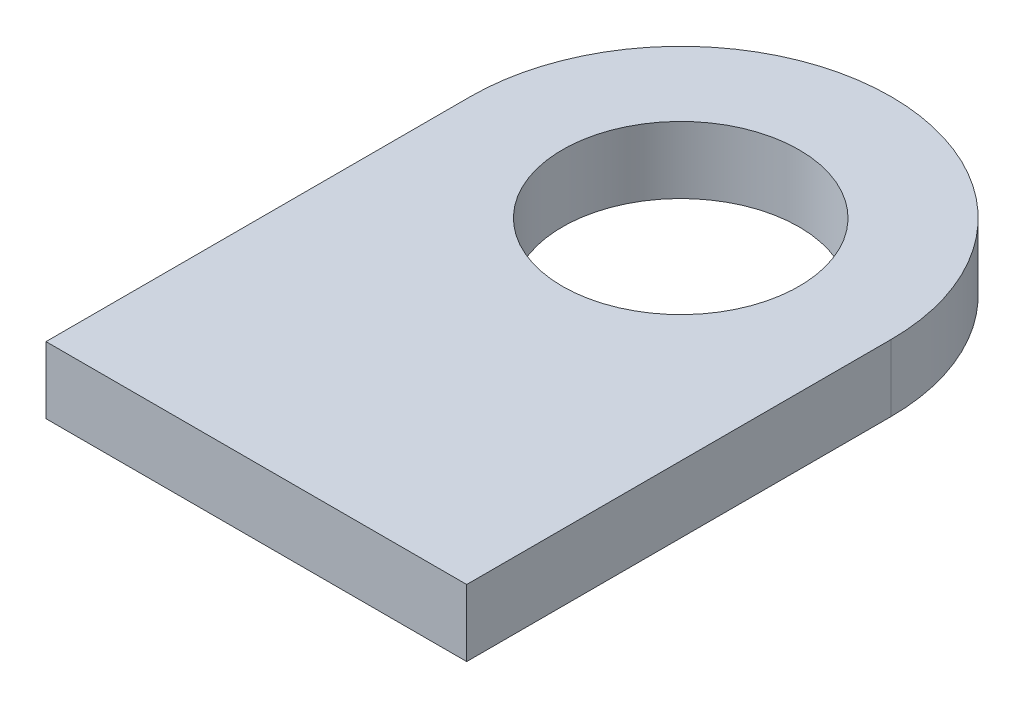
ISO-10303-21;
HEADER;
FILE_DESCRIPTION(('STEP AP214'),'2;1');
FILE_NAME('part.step','',(''),(''),'','','');
FILE_SCHEMA(('AUTOMOTIVE_DESIGN { 1 0 10303 214 1 1 1 1 }'));
ENDSEC;
DATA;
#1=APPLICATION_CONTEXT('core data for automotive mechanical design processes');
#2=APPLICATION_PROTOCOL_DEFINITION('international standard','automotive_design',2000,#1);
#3=PRODUCT_CONTEXT('',#1,'mechanical');
#4=PRODUCT('Part','Part','',(#3));
#5=PRODUCT_RELATED_PRODUCT_CATEGORY('part','',(#4));
#6=PRODUCT_DEFINITION_FORMATION('','',#4);
#7=PRODUCT_DEFINITION_CONTEXT('part definition',#1,'design');
#8=PRODUCT_DEFINITION('design','',#6,#7);
#9=PRODUCT_DEFINITION_SHAPE('','',#8);
#10=(LENGTH_UNIT() NAMED_UNIT(*) SI_UNIT(.MILLI.,.METRE.));
#11=(NAMED_UNIT(*) PLANE_ANGLE_UNIT() SI_UNIT($,.RADIAN.));
#12=(NAMED_UNIT(*) SI_UNIT($,.STERADIAN.) SOLID_ANGLE_UNIT());
#13=UNCERTAINTY_MEASURE_WITH_UNIT(LENGTH_MEASURE(1.E-05),#10,'distance_accuracy_value','');
#14=(GEOMETRIC_REPRESENTATION_CONTEXT(3) GLOBAL_UNCERTAINTY_ASSIGNED_CONTEXT((#13)) GLOBAL_UNIT_ASSIGNED_CONTEXT((#10,
#11,#12)) REPRESENTATION_CONTEXT('',''));
#15=CARTESIAN_POINT('',(0.,0.,0.));
#16=DIRECTION('',(0.,0.,1.));
#17=DIRECTION('',(1.,0.,0.));
#18=AXIS2_PLACEMENT_3D('',#15,#16,#17);
#19=CARTESIAN_POINT('',(-40.,-12.7,-80.7));
#20=DIRECTION('',(-1.,0.,0.));
#21=DIRECTION('',(0.,0.,1.));
#22=AXIS2_PLACEMENT_3D('',#19,#20,#21);
#23=PLANE('',#22);
#24=DIRECTION('',(0.,0.,1.));
#25=VECTOR('',#24,1.);
#26=CARTESIAN_POINT('',(-40.,0.,-80.7));
#27=LINE('',#26,#25);
#28=CARTESIAN_POINT('',(-40.,0.,-80.7));
#29=VERTEX_POINT('',#28);
#30=CARTESIAN_POINT('',(-40.,0.,0.));
#31=VERTEX_POINT('',#30);
#32=EDGE_CURVE('E106',#29,#31,#27,.T.);
#33=ORIENTED_EDGE('',*,*,#32,.F.);
#34=DIRECTION('',(0.,1.,0.));
#35=VECTOR('',#34,1.);
#36=CARTESIAN_POINT('',(-40.,-12.7,-80.7));
#37=LINE('',#36,#35);
#38=CARTESIAN_POINT('',(-40.,-12.7,-80.7));
#39=VERTEX_POINT('',#38);
#40=EDGE_CURVE('E11',#39,#29,#37,.T.);
#41=ORIENTED_EDGE('',*,*,#40,.F.);
#42=DIRECTION('',(0.,0.,1.));
#43=VECTOR('',#42,1.);
#44=CARTESIAN_POINT('',(-40.,-12.7,-80.7));
#45=LINE('',#44,#43);
#46=CARTESIAN_POINT('',(-40.,-12.7,0.));
#47=VERTEX_POINT('',#46);
#48=EDGE_CURVE('E99',#39,#47,#45,.T.);
#49=ORIENTED_EDGE('',*,*,#48,.T.);
#50=DIRECTION('',(0.,1.,0.));
#51=VECTOR('',#50,1.);
#52=CARTESIAN_POINT('',(-40.,-12.7,0.));
#53=LINE('',#52,#51);
#54=EDGE_CURVE('E44',#47,#31,#53,.T.);
#55=ORIENTED_EDGE('',*,*,#54,.T.);
#56=EDGE_LOOP('',(#33,#41,#49,#55));
#57=FACE_BOUND('',#56,.T.);
#58=ADVANCED_FACE('F41',(#57),#23,.T.);
#59=CARTESIAN_POINT('',(0.,-12.7,-80.7));
#60=DIRECTION('',(0.,1.,0.));
#61=DIRECTION('',(0.,0.,1.));
#62=AXIS2_PLACEMENT_3D('',#59,#60,#61);
#63=CYLINDRICAL_SURFACE('',#62,40.);
#64=CARTESIAN_POINT('',(0.,0.,-80.7));
#65=DIRECTION('',(0.,1.,0.));
#66=DIRECTION('',(0.,0.,1.));
#67=AXIS2_PLACEMENT_3D('',#64,#65,#66);
#68=CIRCLE('',#67,40.);
#69=CARTESIAN_POINT('',(40.,0.,-80.7));
#70=VERTEX_POINT('',#69);
#71=EDGE_CURVE('E101',#70,#29,#68,.T.);
#72=ORIENTED_EDGE('',*,*,#71,.F.);
#73=DIRECTION('',(0.,1.,0.));
#74=VECTOR('',#73,1.);
#75=CARTESIAN_POINT('',(40.,-12.7,-80.7));
#76=LINE('',#75,#74);
#77=CARTESIAN_POINT('',(40.,-12.7,-80.7));
#78=VERTEX_POINT('',#77);
#79=EDGE_CURVE('E50',#78,#70,#76,.T.);
#80=ORIENTED_EDGE('',*,*,#79,.F.);
#81=CARTESIAN_POINT('',(0.,-12.7,-80.7));
#82=DIRECTION('',(0.,1.,0.));
#83=DIRECTION('',(0.,0.,1.));
#84=AXIS2_PLACEMENT_3D('',#81,#82,#83);
#85=CIRCLE('',#84,40.);
#86=EDGE_CURVE('E96',#78,#39,#85,.T.);
#87=ORIENTED_EDGE('',*,*,#86,.T.);
#88=ORIENTED_EDGE('',*,*,#40,.T.);
#89=EDGE_LOOP('',(#72,#80,#87,#88));
#90=FACE_BOUND('',#89,.T.);
#91=ADVANCED_FACE('F117',(#90),#63,.T.);
#92=CARTESIAN_POINT('',(40.,-12.7,0.));
#93=DIRECTION('',(1.,0.,0.));
#94=DIRECTION('',(0.,0.,-1.));
#95=AXIS2_PLACEMENT_3D('',#92,#93,#94);
#96=PLANE('',#95);
#97=DIRECTION('',(0.,0.,-1.));
#98=VECTOR('',#97,1.);
#99=CARTESIAN_POINT('',(40.,0.,0.));
#100=LINE('',#99,#98);
#101=CARTESIAN_POINT('',(40.,0.,0.));
#102=VERTEX_POINT('',#101);
#103=EDGE_CURVE('E91',#102,#70,#100,.T.);
#104=ORIENTED_EDGE('',*,*,#103,.F.);
#105=DIRECTION('',(0.,1.,0.));
#106=VECTOR('',#105,1.);
#107=CARTESIAN_POINT('',(40.,-12.7,0.));
#108=LINE('',#107,#106);
#109=CARTESIAN_POINT('',(40.,-12.7,0.));
#110=VERTEX_POINT('',#109);
#111=EDGE_CURVE('E86',#110,#102,#108,.T.);
#112=ORIENTED_EDGE('',*,*,#111,.F.);
#113=DIRECTION('',(0.,0.,-1.));
#114=VECTOR('',#113,1.);
#115=CARTESIAN_POINT('',(40.,-12.7,0.));
#116=LINE('',#115,#114);
#117=EDGE_CURVE('E89',#110,#78,#116,.T.);
#118=ORIENTED_EDGE('',*,*,#117,.T.);
#119=ORIENTED_EDGE('',*,*,#79,.T.);
#120=EDGE_LOOP('',(#104,#112,#118,#119));
#121=FACE_BOUND('',#120,.T.);
#122=ADVANCED_FACE('F88',(#121),#96,.T.);
#123=CARTESIAN_POINT('',(-40.,-12.7,0.));
#124=DIRECTION('',(0.,0.,1.));
#125=DIRECTION('',(1.,0.,0.));
#126=AXIS2_PLACEMENT_3D('',#123,#124,#125);
#127=PLANE('',#126);
#128=DIRECTION('',(1.,0.,0.));
#129=VECTOR('',#128,1.);
#130=CARTESIAN_POINT('',(-40.,0.,0.));
#131=LINE('',#130,#129);
#132=EDGE_CURVE('E109',#31,#102,#131,.T.);
#133=ORIENTED_EDGE('',*,*,#132,.F.);
#134=ORIENTED_EDGE('',*,*,#54,.F.);
#135=DIRECTION('',(1.,0.,0.));
#136=VECTOR('',#135,1.);
#137=CARTESIAN_POINT('',(-40.,-12.7,0.));
#138=LINE('',#137,#136);
#139=EDGE_CURVE('E95',#47,#110,#138,.T.);
#140=ORIENTED_EDGE('',*,*,#139,.T.);
#141=ORIENTED_EDGE('',*,*,#111,.T.);
#142=EDGE_LOOP('',(#133,#134,#140,#141));
#143=FACE_BOUND('',#142,.T.);
#144=ADVANCED_FACE('F98',(#143),#127,.T.);
#145=CARTESIAN_POINT('',(0.,-12.7,-80.7));
#146=DIRECTION('',(0.,1.,0.));
#147=DIRECTION('',(0.,0.,1.));
#148=AXIS2_PLACEMENT_3D('',#145,#146,#147);
#149=PLANE('',#148);
#150=CARTESIAN_POINT('',(0.,-12.7,-80.7));
#151=DIRECTION('',(0.,1.,0.));
#152=DIRECTION('',(0.,0.,1.));
#153=AXIS2_PLACEMENT_3D('',#150,#151,#152);
#154=CIRCLE('',#153,22.5);
#155=CARTESIAN_POINT('',(0.,-12.7,-58.2));
#156=VERTEX_POINT('',#155);
#157=EDGE_CURVE('E110',#156,#156,#154,.T.);
#158=ORIENTED_EDGE('',*,*,#157,.T.);
#159=EDGE_LOOP('',(#158));
#160=FACE_BOUND('',#159,.T.);
#161=ORIENTED_EDGE('',*,*,#48,.F.);
#162=ORIENTED_EDGE('',*,*,#86,.F.);
#163=ORIENTED_EDGE('',*,*,#117,.F.);
#164=ORIENTED_EDGE('',*,*,#139,.F.);
#165=EDGE_LOOP('',(#161,#162,#163,#164));
#166=FACE_BOUND('',#165,.T.);
#167=ADVANCED_FACE('F94',(#160,#166),#149,.F.);
#168=CARTESIAN_POINT('',(0.,0.,-80.7));
#169=DIRECTION('',(0.,1.,0.));
#170=DIRECTION('',(0.,0.,1.));
#171=AXIS2_PLACEMENT_3D('',#168,#169,#170);
#172=PLANE('',#171);
#173=CARTESIAN_POINT('',(0.,0.,-80.7));
#174=DIRECTION('',(0.,1.,0.));
#175=DIRECTION('',(0.,0.,1.));
#176=AXIS2_PLACEMENT_3D('',#173,#174,#175);
#177=CIRCLE('',#176,22.5);
#178=CARTESIAN_POINT('',(0.,0.,-58.2));
#179=VERTEX_POINT('',#178);
#180=EDGE_CURVE('E147',#179,#179,#177,.T.);
#181=ORIENTED_EDGE('',*,*,#180,.F.);
#182=EDGE_LOOP('',(#181));
#183=FACE_BOUND('',#182,.T.);
#184=ORIENTED_EDGE('',*,*,#32,.T.);
#185=ORIENTED_EDGE('',*,*,#132,.T.);
#186=ORIENTED_EDGE('',*,*,#103,.T.);
#187=ORIENTED_EDGE('',*,*,#71,.T.);
#188=EDGE_LOOP('',(#184,#185,#186,#187));
#189=FACE_BOUND('',#188,.T.);
#190=ADVANCED_FACE('F116',(#183,#189),#172,.T.);
#191=CARTESIAN_POINT('',(0.,-12.7,-80.7));
#192=DIRECTION('',(0.,1.,0.));
#193=DIRECTION('',(0.,0.,1.));
#194=AXIS2_PLACEMENT_3D('',#191,#192,#193);
#195=CYLINDRICAL_SURFACE('',#194,22.5);
#196=ORIENTED_EDGE('',*,*,#157,.F.);
#197=EDGE_LOOP('',(#196));
#198=FACE_BOUND('',#197,.T.);
#199=ORIENTED_EDGE('',*,*,#180,.T.);
#200=EDGE_LOOP('',(#199));
#201=FACE_BOUND('',#200,.T.);
#202=ADVANCED_FACE('F135',(#198,#201),#195,.F.);
#203=CLOSED_SHELL('',(#58,#91,#122,#144,#167,#190,#202));
#204=MANIFOLD_SOLID_BREP('B2',#203);
#205=ADVANCED_BREP_SHAPE_REPRESENTATION('',(#18,#204),#14);
#206=SHAPE_DEFINITION_REPRESENTATION(#9,#205);
ENDSEC;
END-ISO-10303-21;
